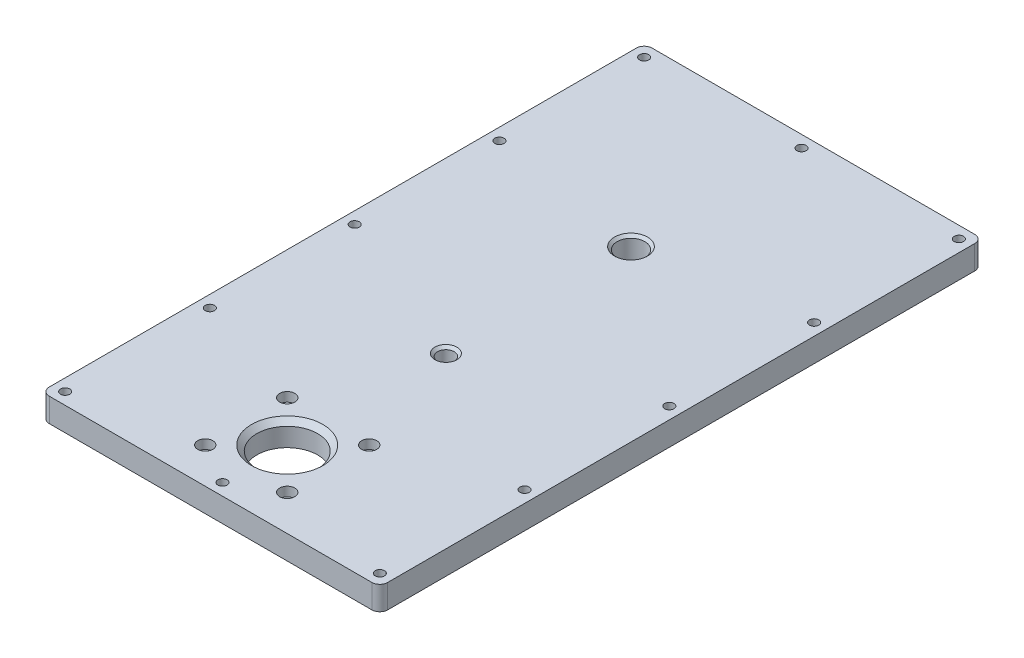
ISO-10303-21;
HEADER;
FILE_DESCRIPTION(('STEP AP214'),'2;1');
FILE_NAME('part.step','',(''),(''),'','','');
FILE_SCHEMA(('AUTOMOTIVE_DESIGN { 1 0 10303 214 1 1 1 1 }'));
ENDSEC;
DATA;
#1=APPLICATION_CONTEXT('core data for automotive mechanical design processes');
#2=APPLICATION_PROTOCOL_DEFINITION('international standard','automotive_design',2000,#1);
#3=PRODUCT_CONTEXT('',#1,'mechanical');
#4=PRODUCT('Part','Part','',(#3));
#5=PRODUCT_RELATED_PRODUCT_CATEGORY('part','',(#4));
#6=PRODUCT_DEFINITION_FORMATION('','',#4);
#7=PRODUCT_DEFINITION_CONTEXT('part definition',#1,'design');
#8=PRODUCT_DEFINITION('design','',#6,#7);
#9=PRODUCT_DEFINITION_SHAPE('','',#8);
#10=(LENGTH_UNIT() NAMED_UNIT(*) SI_UNIT(.MILLI.,.METRE.));
#11=(NAMED_UNIT(*) PLANE_ANGLE_UNIT() SI_UNIT($,.RADIAN.));
#12=(NAMED_UNIT(*) SI_UNIT($,.STERADIAN.) SOLID_ANGLE_UNIT());
#13=UNCERTAINTY_MEASURE_WITH_UNIT(LENGTH_MEASURE(1.E-05),#10,'distance_accuracy_value','');
#14=(GEOMETRIC_REPRESENTATION_CONTEXT(3) GLOBAL_UNCERTAINTY_ASSIGNED_CONTEXT((#13)) GLOBAL_UNIT_ASSIGNED_CONTEXT((#10,
#11,#12)) REPRESENTATION_CONTEXT('',''));
#15=CARTESIAN_POINT('',(0.,0.,0.));
#16=DIRECTION('',(0.,0.,1.));
#17=DIRECTION('',(1.,0.,0.));
#18=AXIS2_PLACEMENT_3D('',#15,#16,#17);
#19=CARTESIAN_POINT('',(0.,-30.5,0.));
#20=DIRECTION('',(0.,1.,0.));
#21=DIRECTION('',(0.,0.,1.));
#22=AXIS2_PLACEMENT_3D('',#19,#20,#21);
#23=CYLINDRICAL_SURFACE('',#22,3.15);
#24=CARTESIAN_POINT('',(0.,-22.5,0.));
#25=DIRECTION('',(0.,-1.,0.));
#26=DIRECTION('',(0.,0.,-1.));
#27=AXIS2_PLACEMENT_3D('',#24,#25,#26);
#28=CIRCLE('',#27,3.15);
#29=CARTESIAN_POINT('',(0.,-22.5,-3.15));
#30=VERTEX_POINT('',#29);
#31=EDGE_CURVE('E42',#30,#30,#28,.F.);
#32=ORIENTED_EDGE('',*,*,#31,.T.);
#33=EDGE_LOOP('',(#32));
#34=FACE_BOUND('',#33,.T.);
#35=CARTESIAN_POINT('',(0.,-27.5,0.));
#36=DIRECTION('',(0.,-1.,0.));
#37=DIRECTION('',(0.,0.,-1.));
#38=AXIS2_PLACEMENT_3D('',#35,#36,#37);
#39=CIRCLE('',#38,3.15);
#40=CARTESIAN_POINT('',(0.,-27.5,-3.15));
#41=VERTEX_POINT('',#40);
#42=EDGE_CURVE('E502',#41,#41,#39,.T.);
#43=ORIENTED_EDGE('',*,*,#42,.T.);
#44=EDGE_LOOP('',(#43));
#45=FACE_BOUND('',#44,.T.);
#46=ADVANCED_FACE('F34',(#34,#45),#23,.F.);
#47=CARTESIAN_POINT('',(-15.5,-30.5,75.5));
#48=DIRECTION('',(0.,1.,0.));
#49=DIRECTION('',(0.,0.,1.));
#50=AXIS2_PLACEMENT_3D('',#47,#48,#49);
#51=CYLINDRICAL_SURFACE('',#50,1.75);
#52=CARTESIAN_POINT('',(-15.5,-30.5,75.5));
#53=DIRECTION('',(0.,-1.,0.));
#54=DIRECTION('',(0.,0.,-1.));
#55=AXIS2_PLACEMENT_3D('',#52,#53,#54);
#56=CIRCLE('',#55,1.75);
#57=CARTESIAN_POINT('',(-15.5,-30.5,73.75));
#58=VERTEX_POINT('',#57);
#59=EDGE_CURVE('E136',#58,#58,#56,.T.);
#60=ORIENTED_EDGE('',*,*,#59,.T.);
#61=EDGE_LOOP('',(#60));
#62=FACE_BOUND('',#61,.T.);
#63=CARTESIAN_POINT('',(-15.5,-25.,75.5));
#64=DIRECTION('',(0.,1.,0.));
#65=DIRECTION('',(0.,0.,1.));
#66=AXIS2_PLACEMENT_3D('',#63,#64,#65);
#67=CIRCLE('',#66,1.75);
#68=CARTESIAN_POINT('',(-15.5,-25.,77.25));
#69=VERTEX_POINT('',#68);
#70=EDGE_CURVE('E155',#69,#69,#67,.T.);
#71=ORIENTED_EDGE('',*,*,#70,.T.);
#72=EDGE_LOOP('',(#71));
#73=FACE_BOUND('',#72,.T.);
#74=ADVANCED_FACE('F356',(#62,#73),#51,.F.);
#75=CARTESIAN_POINT('',(15.5,-30.5,75.5));
#76=DIRECTION('',(0.,1.,0.));
#77=DIRECTION('',(0.,0.,1.));
#78=AXIS2_PLACEMENT_3D('',#75,#76,#77);
#79=CYLINDRICAL_SURFACE('',#78,1.75);
#80=CARTESIAN_POINT('',(15.5,-30.5,75.5));
#81=DIRECTION('',(0.,-1.,0.));
#82=DIRECTION('',(0.,0.,-1.));
#83=AXIS2_PLACEMENT_3D('',#80,#81,#82);
#84=CIRCLE('',#83,1.75);
#85=CARTESIAN_POINT('',(15.5,-30.5,73.75));
#86=VERTEX_POINT('',#85);
#87=EDGE_CURVE('E316',#86,#86,#84,.T.);
#88=ORIENTED_EDGE('',*,*,#87,.T.);
#89=EDGE_LOOP('',(#88));
#90=FACE_BOUND('',#89,.T.);
#91=CARTESIAN_POINT('',(15.5,-25.,75.5));
#92=DIRECTION('',(0.,1.,0.));
#93=DIRECTION('',(0.,0.,1.));
#94=AXIS2_PLACEMENT_3D('',#91,#92,#93);
#95=CIRCLE('',#94,1.75);
#96=CARTESIAN_POINT('',(15.5,-25.,77.25));
#97=VERTEX_POINT('',#96);
#98=EDGE_CURVE('E152',#97,#97,#95,.T.);
#99=ORIENTED_EDGE('',*,*,#98,.T.);
#100=EDGE_LOOP('',(#99));
#101=FACE_BOUND('',#100,.T.);
#102=ADVANCED_FACE('F361',(#90,#101),#79,.F.);
#103=CARTESIAN_POINT('',(-15.5,-30.5,44.5));
#104=DIRECTION('',(0.,1.,0.));
#105=DIRECTION('',(0.,0.,1.));
#106=AXIS2_PLACEMENT_3D('',#103,#104,#105);
#107=CYLINDRICAL_SURFACE('',#106,1.75);
#108=CARTESIAN_POINT('',(-15.5,-30.5,44.5));
#109=DIRECTION('',(0.,-1.,0.));
#110=DIRECTION('',(0.,0.,-1.));
#111=AXIS2_PLACEMENT_3D('',#108,#109,#110);
#112=CIRCLE('',#111,1.75);
#113=CARTESIAN_POINT('',(-15.5,-30.5,42.75));
#114=VERTEX_POINT('',#113);
#115=EDGE_CURVE('E313',#114,#114,#112,.T.);
#116=ORIENTED_EDGE('',*,*,#115,.T.);
#117=EDGE_LOOP('',(#116));
#118=FACE_BOUND('',#117,.T.);
#119=CARTESIAN_POINT('',(-15.5,-25.,44.5));
#120=DIRECTION('',(0.,1.,0.));
#121=DIRECTION('',(0.,0.,1.));
#122=AXIS2_PLACEMENT_3D('',#119,#120,#121);
#123=CIRCLE('',#122,1.75);
#124=CARTESIAN_POINT('',(-15.5,-25.,46.25));
#125=VERTEX_POINT('',#124);
#126=EDGE_CURVE('E148',#125,#125,#123,.T.);
#127=ORIENTED_EDGE('',*,*,#126,.T.);
#128=EDGE_LOOP('',(#127));
#129=FACE_BOUND('',#128,.T.);
#130=ADVANCED_FACE('F420',(#118,#129),#107,.F.);
#131=CARTESIAN_POINT('',(15.5,-30.5,44.5));
#132=DIRECTION('',(0.,1.,0.));
#133=DIRECTION('',(0.,0.,1.));
#134=AXIS2_PLACEMENT_3D('',#131,#132,#133);
#135=CYLINDRICAL_SURFACE('',#134,1.75);
#136=CARTESIAN_POINT('',(15.5,-30.5,44.5));
#137=DIRECTION('',(0.,-1.,0.));
#138=DIRECTION('',(0.,0.,-1.));
#139=AXIS2_PLACEMENT_3D('',#136,#137,#138);
#140=CIRCLE('',#139,1.75);
#141=CARTESIAN_POINT('',(15.5,-30.5,42.75));
#142=VERTEX_POINT('',#141);
#143=EDGE_CURVE('E308',#142,#142,#140,.T.);
#144=ORIENTED_EDGE('',*,*,#143,.T.);
#145=EDGE_LOOP('',(#144));
#146=FACE_BOUND('',#145,.T.);
#147=CARTESIAN_POINT('',(15.5,-25.,44.5));
#148=DIRECTION('',(0.,1.,0.));
#149=DIRECTION('',(0.,0.,1.));
#150=AXIS2_PLACEMENT_3D('',#147,#148,#149);
#151=CIRCLE('',#150,1.75);
#152=CARTESIAN_POINT('',(15.5,-25.,46.25));
#153=VERTEX_POINT('',#152);
#154=EDGE_CURVE('E145',#153,#153,#151,.T.);
#155=ORIENTED_EDGE('',*,*,#154,.T.);
#156=EDGE_LOOP('',(#155));
#157=FACE_BOUND('',#156,.T.);
#158=ADVANCED_FACE('F417',(#146,#157),#135,.F.);
#159=CARTESIAN_POINT('',(0.,-30.5,0.));
#160=DIRECTION('',(0.,-1.,0.));
#161=DIRECTION('',(0.,0.,-1.));
#162=AXIS2_PLACEMENT_3D('',#159,#160,#161);
#163=PLANE('',#162);
#164=CARTESIAN_POINT('',(0.,-30.5,84.5));
#165=DIRECTION('',(0.,-1.,0.));
#166=DIRECTION('',(0.,0.,-1.));
#167=AXIS2_PLACEMENT_3D('',#164,#165,#166);
#168=CIRCLE('',#167,1.75);
#169=CARTESIAN_POINT('',(0.,-30.5,82.75));
#170=VERTEX_POINT('',#169);
#171=EDGE_CURVE('E245',#170,#170,#168,.T.);
#172=ORIENTED_EDGE('',*,*,#171,.F.);
#173=EDGE_LOOP('',(#172));
#174=FACE_BOUND('',#173,.T.);
#175=CARTESIAN_POINT('',(59.5,-30.5,29.75));
#176=DIRECTION('',(0.,-1.,0.));
#177=DIRECTION('',(0.,0.,-1.));
#178=AXIS2_PLACEMENT_3D('',#175,#176,#177);
#179=CIRCLE('',#178,1.75);
#180=CARTESIAN_POINT('',(59.5,-30.5,28.));
#181=VERTEX_POINT('',#180);
#182=EDGE_CURVE('E257',#181,#181,#179,.T.);
#183=ORIENTED_EDGE('',*,*,#182,.F.);
#184=EDGE_LOOP('',(#183));
#185=FACE_BOUND('',#184,.T.);
#186=CARTESIAN_POINT('',(-59.5,-30.5,29.75));
#187=DIRECTION('',(0.,-1.,0.));
#188=DIRECTION('',(0.,0.,-1.));
#189=AXIS2_PLACEMENT_3D('',#186,#187,#188);
#190=CIRCLE('',#189,1.75);
#191=CARTESIAN_POINT('',(-59.5,-30.5,28.));
#192=VERTEX_POINT('',#191);
#193=EDGE_CURVE('E269',#192,#192,#190,.T.);
#194=ORIENTED_EDGE('',*,*,#193,.F.);
#195=EDGE_LOOP('',(#194));
#196=FACE_BOUND('',#195,.T.);
#197=CARTESIAN_POINT('',(-59.5,-30.5,-79.75));
#198=DIRECTION('',(0.,-1.,0.));
#199=DIRECTION('',(0.,0.,-1.));
#200=AXIS2_PLACEMENT_3D('',#197,#198,#199);
#201=CIRCLE('',#200,1.75);
#202=CARTESIAN_POINT('',(-59.5,-30.5,-81.5));
#203=VERTEX_POINT('',#202);
#204=EDGE_CURVE('E281',#203,#203,#201,.T.);
#205=ORIENTED_EDGE('',*,*,#204,.F.);
#206=EDGE_LOOP('',(#205));
#207=FACE_BOUND('',#206,.T.);
#208=CARTESIAN_POINT('',(59.5,-30.5,-134.5));
#209=DIRECTION('',(0.,-1.,0.));
#210=DIRECTION('',(0.,0.,-1.));
#211=AXIS2_PLACEMENT_3D('',#208,#209,#210);
#212=CIRCLE('',#211,1.75);
#213=CARTESIAN_POINT('',(59.5,-30.5,-136.25));
#214=VERTEX_POINT('',#213);
#215=EDGE_CURVE('E293',#214,#214,#212,.T.);
#216=ORIENTED_EDGE('',*,*,#215,.F.);
#217=EDGE_LOOP('',(#216));
#218=FACE_BOUND('',#217,.T.);
#219=CARTESIAN_POINT('',(-59.5,-30.5,-134.5));
#220=DIRECTION('',(0.,-1.,0.));
#221=DIRECTION('',(0.,0.,-1.));
#222=AXIS2_PLACEMENT_3D('',#219,#220,#221);
#223=CIRCLE('',#222,1.75);
#224=CARTESIAN_POINT('',(-59.5,-30.5,-136.25));
#225=VERTEX_POINT('',#224);
#226=EDGE_CURVE('E305',#225,#225,#223,.T.);
#227=ORIENTED_EDGE('',*,*,#226,.F.);
#228=EDGE_LOOP('',(#227));
#229=FACE_BOUND('',#228,.T.);
#230=ORIENTED_EDGE('',*,*,#115,.F.);
#231=EDGE_LOOP('',(#230));
#232=FACE_BOUND('',#231,.T.);
#233=ORIENTED_EDGE('',*,*,#59,.F.);
#234=EDGE_LOOP('',(#233));
#235=FACE_BOUND('',#234,.T.);
#236=DIRECTION('',(-1.,0.,0.));
#237=VECTOR('',#236,1.);
#238=CARTESIAN_POINT('',(-64.,-30.5,89.));
#239=LINE('',#238,#237);
#240=CARTESIAN_POINT('',(61.,-30.5,89.));
#241=VERTEX_POINT('',#240);
#242=CARTESIAN_POINT('',(-61.,-30.5,89.));
#243=VERTEX_POINT('',#242);
#244=EDGE_CURVE('E139',#241,#243,#239,.T.);
#245=ORIENTED_EDGE('',*,*,#244,.T.);
#246=CARTESIAN_POINT('',(-61.,-30.5,86.));
#247=DIRECTION('',(0.,-1.,0.));
#248=DIRECTION('',(0.,0.,-1.));
#249=AXIS2_PLACEMENT_3D('',#246,#247,#248);
#250=CIRCLE('',#249,3.);
#251=CARTESIAN_POINT('',(-64.,-30.5,86.));
#252=VERTEX_POINT('',#251);
#253=EDGE_CURVE('E171',#243,#252,#250,.T.);
#254=ORIENTED_EDGE('',*,*,#253,.T.);
#255=DIRECTION('',(0.,0.,-1.));
#256=VECTOR('',#255,1.);
#257=CARTESIAN_POINT('',(-64.,-30.5,89.));
#258=LINE('',#257,#256);
#259=CARTESIAN_POINT('',(-64.,-30.5,-136.));
#260=VERTEX_POINT('',#259);
#261=EDGE_CURVE('E121',#252,#260,#258,.T.);
#262=ORIENTED_EDGE('',*,*,#261,.T.);
#263=CARTESIAN_POINT('',(-61.,-30.5,-136.));
#264=DIRECTION('',(0.,-1.,0.));
#265=DIRECTION('',(0.,0.,-1.));
#266=AXIS2_PLACEMENT_3D('',#263,#264,#265);
#267=CIRCLE('',#266,3.);
#268=CARTESIAN_POINT('',(-61.,-30.5,-139.));
#269=VERTEX_POINT('',#268);
#270=EDGE_CURVE('E167',#260,#269,#267,.T.);
#271=ORIENTED_EDGE('',*,*,#270,.T.);
#272=DIRECTION('',(1.,0.,0.));
#273=VECTOR('',#272,1.);
#274=CARTESIAN_POINT('',(-64.,-30.5,-139.));
#275=LINE('',#274,#273);
#276=CARTESIAN_POINT('',(61.,-30.5,-139.));
#277=VERTEX_POINT('',#276);
#278=EDGE_CURVE('E322',#269,#277,#275,.T.);
#279=ORIENTED_EDGE('',*,*,#278,.T.);
#280=CARTESIAN_POINT('',(61.,-30.5,-136.));
#281=DIRECTION('',(0.,-1.,0.));
#282=DIRECTION('',(0.,0.,-1.));
#283=AXIS2_PLACEMENT_3D('',#280,#281,#282);
#284=CIRCLE('',#283,3.);
#285=CARTESIAN_POINT('',(64.,-30.5,-136.));
#286=VERTEX_POINT('',#285);
#287=EDGE_CURVE('E56',#277,#286,#284,.T.);
#288=ORIENTED_EDGE('',*,*,#287,.T.);
#289=DIRECTION('',(0.,0.,1.));
#290=VECTOR('',#289,1.);
#291=CARTESIAN_POINT('',(64.,-30.5,89.));
#292=LINE('',#291,#290);
#293=CARTESIAN_POINT('',(64.,-30.5,86.));
#294=VERTEX_POINT('',#293);
#295=EDGE_CURVE('E323',#286,#294,#292,.T.);
#296=ORIENTED_EDGE('',*,*,#295,.T.);
#297=CARTESIAN_POINT('',(61.,-30.5,86.));
#298=DIRECTION('',(0.,-1.,0.));
#299=DIRECTION('',(0.,0.,-1.));
#300=AXIS2_PLACEMENT_3D('',#297,#298,#299);
#301=CIRCLE('',#300,3.);
#302=EDGE_CURVE('E169',#294,#241,#301,.T.);
#303=ORIENTED_EDGE('',*,*,#302,.T.);
#304=EDGE_LOOP('',(#245,#254,#262,#271,#279,#288,#296,#303));
#305=FACE_BOUND('',#304,.T.);
#306=CARTESIAN_POINT('',(0.,-30.5,60.));
#307=DIRECTION('',(0.,-1.,0.));
#308=DIRECTION('',(0.,0.,-1.));
#309=AXIS2_PLACEMENT_3D('',#306,#307,#308);
#310=CIRCLE('',#309,11.5);
#311=CARTESIAN_POINT('',(0.,-30.5,48.5));
#312=VERTEX_POINT('',#311);
#313=EDGE_CURVE('E130',#312,#312,#310,.T.);
#314=ORIENTED_EDGE('',*,*,#313,.F.);
#315=EDGE_LOOP('',(#314));
#316=FACE_BOUND('',#315,.T.);
#317=ORIENTED_EDGE('',*,*,#87,.F.);
#318=EDGE_LOOP('',(#317));
#319=FACE_BOUND('',#318,.T.);
#320=ORIENTED_EDGE('',*,*,#143,.F.);
#321=EDGE_LOOP('',(#320));
#322=FACE_BOUND('',#321,.T.);
#323=CARTESIAN_POINT('',(0.,-30.5,-134.5));
#324=DIRECTION('',(0.,-1.,0.));
#325=DIRECTION('',(0.,0.,-1.));
#326=AXIS2_PLACEMENT_3D('',#323,#324,#325);
#327=CIRCLE('',#326,1.75);
#328=CARTESIAN_POINT('',(0.,-30.5,-136.25));
#329=VERTEX_POINT('',#328);
#330=EDGE_CURVE('E299',#329,#329,#327,.T.);
#331=ORIENTED_EDGE('',*,*,#330,.F.);
#332=EDGE_LOOP('',(#331));
#333=FACE_BOUND('',#332,.T.);
#334=CARTESIAN_POINT('',(59.5,-30.5,-79.75));
#335=DIRECTION('',(0.,-1.,0.));
#336=DIRECTION('',(0.,0.,-1.));
#337=AXIS2_PLACEMENT_3D('',#334,#335,#336);
#338=CIRCLE('',#337,1.75);
#339=CARTESIAN_POINT('',(59.5,-30.5,-81.5));
#340=VERTEX_POINT('',#339);
#341=EDGE_CURVE('E287',#340,#340,#338,.T.);
#342=ORIENTED_EDGE('',*,*,#341,.F.);
#343=EDGE_LOOP('',(#342));
#344=FACE_BOUND('',#343,.T.);
#345=CARTESIAN_POINT('',(-59.5,-30.5,-25.));
#346=DIRECTION('',(0.,-1.,0.));
#347=DIRECTION('',(0.,0.,-1.));
#348=AXIS2_PLACEMENT_3D('',#345,#346,#347);
#349=CIRCLE('',#348,1.75);
#350=CARTESIAN_POINT('',(-59.5,-30.5,-26.75));
#351=VERTEX_POINT('',#350);
#352=EDGE_CURVE('E275',#351,#351,#349,.T.);
#353=ORIENTED_EDGE('',*,*,#352,.F.);
#354=EDGE_LOOP('',(#353));
#355=FACE_BOUND('',#354,.T.);
#356=CARTESIAN_POINT('',(59.5,-30.5,-25.));
#357=DIRECTION('',(0.,-1.,0.));
#358=DIRECTION('',(0.,0.,-1.));
#359=AXIS2_PLACEMENT_3D('',#356,#357,#358);
#360=CIRCLE('',#359,1.75);
#361=CARTESIAN_POINT('',(59.5,-30.5,-26.75));
#362=VERTEX_POINT('',#361);
#363=EDGE_CURVE('E263',#362,#362,#360,.T.);
#364=ORIENTED_EDGE('',*,*,#363,.F.);
#365=EDGE_LOOP('',(#364));
#366=FACE_BOUND('',#365,.T.);
#367=CARTESIAN_POINT('',(59.5,-30.5,84.5));
#368=DIRECTION('',(0.,-1.,0.));
#369=DIRECTION('',(0.,0.,-1.));
#370=AXIS2_PLACEMENT_3D('',#367,#368,#369);
#371=CIRCLE('',#370,1.75);
#372=CARTESIAN_POINT('',(59.5,-30.5,82.75));
#373=VERTEX_POINT('',#372);
#374=EDGE_CURVE('E251',#373,#373,#371,.T.);
#375=ORIENTED_EDGE('',*,*,#374,.F.);
#376=EDGE_LOOP('',(#375));
#377=FACE_BOUND('',#376,.T.);
#378=CARTESIAN_POINT('',(-59.5,-30.5,84.5));
#379=DIRECTION('',(0.,-1.,0.));
#380=DIRECTION('',(0.,0.,-1.));
#381=AXIS2_PLACEMENT_3D('',#378,#379,#380);
#382=CIRCLE('',#381,1.75);
#383=CARTESIAN_POINT('',(-59.5,-30.5,82.75));
#384=VERTEX_POINT('',#383);
#385=EDGE_CURVE('E239',#384,#384,#382,.T.);
#386=ORIENTED_EDGE('',*,*,#385,.F.);
#387=EDGE_LOOP('',(#386));
#388=FACE_BOUND('',#387,.T.);
#389=CARTESIAN_POINT('',(0.,-30.5,-70.));
#390=DIRECTION('',(0.,-1.,0.));
#391=DIRECTION('',(0.,0.,-1.));
#392=AXIS2_PLACEMENT_3D('',#389,#390,#391);
#393=CIRCLE('',#392,5.25);
#394=CARTESIAN_POINT('',(0.,-30.5,-75.25));
#395=VERTEX_POINT('',#394);
#396=EDGE_CURVE('E158',#395,#395,#393,.T.);
#397=ORIENTED_EDGE('',*,*,#396,.F.);
#398=EDGE_LOOP('',(#397));
#399=FACE_BOUND('',#398,.T.);
#400=ADVANCED_FACE('F206',(#174,#185,#196,#207,#218,#229,#232,#235,#305,#316,#319,#322,#333,
#344,#355,#366,#377,#388,#399),#163,.T.);
#401=CARTESIAN_POINT('',(0.,-21.5,0.));
#402=DIRECTION('',(0.,-1.,0.));
#403=DIRECTION('',(0.,0.,-1.));
#404=AXIS2_PLACEMENT_3D('',#401,#402,#403);
#405=PLANE('',#404);
#406=CARTESIAN_POINT('',(0.,-21.5,0.));
#407=DIRECTION('',(0.,-1.,0.));
#408=DIRECTION('',(0.,0.,-1.));
#409=AXIS2_PLACEMENT_3D('',#406,#407,#408);
#410=CIRCLE('',#409,4.15000000000001);
#411=CARTESIAN_POINT('',(0.,-21.5,-4.15000000000001));
#412=VERTEX_POINT('',#411);
#413=EDGE_CURVE('E191',#412,#412,#410,.T.);
#414=ORIENTED_EDGE('',*,*,#413,.T.);
#415=EDGE_LOOP('',(#414));
#416=FACE_BOUND('',#415,.T.);
#417=CARTESIAN_POINT('',(0.,-21.5,-70.));
#418=DIRECTION('',(0.,-1.,0.));
#419=DIRECTION('',(0.,0.,-1.));
#420=AXIS2_PLACEMENT_3D('',#417,#418,#419);
#421=CIRCLE('',#420,6.25000000000001);
#422=CARTESIAN_POINT('',(0.,-21.5,-76.25));
#423=VERTEX_POINT('',#422);
#424=EDGE_CURVE('E188',#423,#423,#421,.T.);
#425=ORIENTED_EDGE('',*,*,#424,.T.);
#426=EDGE_LOOP('',(#425));
#427=FACE_BOUND('',#426,.T.);
#428=CARTESIAN_POINT('',(0.,-21.5,60.));
#429=DIRECTION('',(0.,-1.,0.));
#430=DIRECTION('',(0.,0.,-1.));
#431=AXIS2_PLACEMENT_3D('',#428,#429,#430);
#432=CIRCLE('',#431,13.5);
#433=CARTESIAN_POINT('',(0.,-21.5,46.5));
#434=VERTEX_POINT('',#433);
#435=EDGE_CURVE('E182',#434,#434,#432,.T.);
#436=ORIENTED_EDGE('',*,*,#435,.T.);
#437=EDGE_LOOP('',(#436));
#438=FACE_BOUND('',#437,.T.);
#439=CARTESIAN_POINT('',(-15.5,-21.5,75.5));
#440=DIRECTION('',(0.,1.,0.));
#441=DIRECTION('',(0.,0.,1.));
#442=AXIS2_PLACEMENT_3D('',#439,#440,#441);
#443=CIRCLE('',#442,2.86);
#444=CARTESIAN_POINT('',(-15.5,-21.5,78.36));
#445=VERTEX_POINT('',#444);
#446=EDGE_CURVE('E215',#445,#445,#443,.T.);
#447=ORIENTED_EDGE('',*,*,#446,.F.);
#448=EDGE_LOOP('',(#447));
#449=FACE_BOUND('',#448,.T.);
#450=CARTESIAN_POINT('',(15.5,-21.5,75.5));
#451=DIRECTION('',(0.,1.,0.));
#452=DIRECTION('',(0.,0.,1.));
#453=AXIS2_PLACEMENT_3D('',#450,#451,#452);
#454=CIRCLE('',#453,2.86);
#455=CARTESIAN_POINT('',(15.5,-21.5,78.36));
#456=VERTEX_POINT('',#455);
#457=EDGE_CURVE('E219',#456,#456,#454,.T.);
#458=ORIENTED_EDGE('',*,*,#457,.F.);
#459=EDGE_LOOP('',(#458));
#460=FACE_BOUND('',#459,.T.);
#461=CARTESIAN_POINT('',(15.5,-21.5,44.5));
#462=DIRECTION('',(0.,1.,0.));
#463=DIRECTION('',(0.,0.,1.));
#464=AXIS2_PLACEMENT_3D('',#461,#462,#463);
#465=CIRCLE('',#464,2.86);
#466=CARTESIAN_POINT('',(15.5,-21.5,47.36));
#467=VERTEX_POINT('',#466);
#468=EDGE_CURVE('E223',#467,#467,#465,.T.);
#469=ORIENTED_EDGE('',*,*,#468,.F.);
#470=EDGE_LOOP('',(#469));
#471=FACE_BOUND('',#470,.T.);
#472=CARTESIAN_POINT('',(-15.5,-21.5,44.5));
#473=DIRECTION('',(0.,1.,0.));
#474=DIRECTION('',(0.,0.,1.));
#475=AXIS2_PLACEMENT_3D('',#472,#473,#474);
#476=CIRCLE('',#475,2.86);
#477=CARTESIAN_POINT('',(-15.5,-21.5,47.36));
#478=VERTEX_POINT('',#477);
#479=EDGE_CURVE('E226',#478,#478,#476,.T.);
#480=ORIENTED_EDGE('',*,*,#479,.F.);
#481=EDGE_LOOP('',(#480));
#482=FACE_BOUND('',#481,.T.);
#483=DIRECTION('',(0.,0.,-1.));
#484=VECTOR('',#483,1.);
#485=CARTESIAN_POINT('',(-64.,-21.5,89.));
#486=LINE('',#485,#484);
#487=CARTESIAN_POINT('',(-64.,-21.5,86.));
#488=VERTEX_POINT('',#487);
#489=CARTESIAN_POINT('',(-64.,-21.5,-136.));
#490=VERTEX_POINT('',#489);
#491=EDGE_CURVE('E118',#488,#490,#486,.T.);
#492=ORIENTED_EDGE('',*,*,#491,.F.);
#493=CARTESIAN_POINT('',(-61.,-21.5,86.));
#494=DIRECTION('',(0.,-1.,0.));
#495=DIRECTION('',(0.,0.,-1.));
#496=AXIS2_PLACEMENT_3D('',#493,#494,#495);
#497=CIRCLE('',#496,3.);
#498=CARTESIAN_POINT('',(-61.,-21.5,89.));
#499=VERTEX_POINT('',#498);
#500=EDGE_CURVE('E101',#488,#499,#497,.F.);
#501=ORIENTED_EDGE('',*,*,#500,.T.);
#502=DIRECTION('',(-1.,0.,0.));
#503=VECTOR('',#502,1.);
#504=CARTESIAN_POINT('',(-64.,-21.5,89.));
#505=LINE('',#504,#503);
#506=CARTESIAN_POINT('',(61.,-21.5,89.));
#507=VERTEX_POINT('',#506);
#508=EDGE_CURVE('E143',#507,#499,#505,.T.);
#509=ORIENTED_EDGE('',*,*,#508,.F.);
#510=CARTESIAN_POINT('',(61.,-21.5,86.));
#511=DIRECTION('',(0.,-1.,0.));
#512=DIRECTION('',(0.,0.,-1.));
#513=AXIS2_PLACEMENT_3D('',#510,#511,#512);
#514=CIRCLE('',#513,3.);
#515=CARTESIAN_POINT('',(64.,-21.5,86.));
#516=VERTEX_POINT('',#515);
#517=EDGE_CURVE('E112',#507,#516,#514,.F.);
#518=ORIENTED_EDGE('',*,*,#517,.T.);
#519=DIRECTION('',(0.,0.,1.));
#520=VECTOR('',#519,1.);
#521=CARTESIAN_POINT('',(64.,-21.5,89.));
#522=LINE('',#521,#520);
#523=CARTESIAN_POINT('',(64.,-21.5,-136.));
#524=VERTEX_POINT('',#523);
#525=EDGE_CURVE('E133',#524,#516,#522,.T.);
#526=ORIENTED_EDGE('',*,*,#525,.F.);
#527=CARTESIAN_POINT('',(61.,-21.5,-136.));
#528=DIRECTION('',(0.,-1.,0.));
#529=DIRECTION('',(0.,0.,-1.));
#530=AXIS2_PLACEMENT_3D('',#527,#528,#529);
#531=CIRCLE('',#530,3.);
#532=CARTESIAN_POINT('',(61.,-21.5,-139.));
#533=VERTEX_POINT('',#532);
#534=EDGE_CURVE('E122',#524,#533,#531,.F.);
#535=ORIENTED_EDGE('',*,*,#534,.T.);
#536=DIRECTION('',(1.,0.,0.));
#537=VECTOR('',#536,1.);
#538=CARTESIAN_POINT('',(-64.,-21.5,-139.));
#539=LINE('',#538,#537);
#540=CARTESIAN_POINT('',(-61.,-21.5,-139.));
#541=VERTEX_POINT('',#540);
#542=EDGE_CURVE('E129',#541,#533,#539,.T.);
#543=ORIENTED_EDGE('',*,*,#542,.F.);
#544=CARTESIAN_POINT('',(-61.,-21.5,-136.));
#545=DIRECTION('',(0.,-1.,0.));
#546=DIRECTION('',(0.,0.,-1.));
#547=AXIS2_PLACEMENT_3D('',#544,#545,#546);
#548=CIRCLE('',#547,3.);
#549=EDGE_CURVE('E128',#541,#490,#548,.F.);
#550=ORIENTED_EDGE('',*,*,#549,.T.);
#551=EDGE_LOOP('',(#492,#501,#509,#518,#526,#535,#543,#550));
#552=FACE_BOUND('',#551,.T.);
#553=CARTESIAN_POINT('',(-59.5,-21.5,-134.5));
#554=DIRECTION('',(0.,-1.,0.));
#555=DIRECTION('',(0.,0.,-1.));
#556=AXIS2_PLACEMENT_3D('',#553,#554,#555);
#557=CIRCLE('',#556,1.75);
#558=CARTESIAN_POINT('',(-59.5,-21.5,-136.25));
#559=VERTEX_POINT('',#558);
#560=EDGE_CURVE('E302',#559,#559,#557,.T.);
#561=ORIENTED_EDGE('',*,*,#560,.T.);
#562=EDGE_LOOP('',(#561));
#563=FACE_BOUND('',#562,.T.);
#564=CARTESIAN_POINT('',(0.,-21.5,-134.5));
#565=DIRECTION('',(0.,-1.,0.));
#566=DIRECTION('',(0.,0.,-1.));
#567=AXIS2_PLACEMENT_3D('',#564,#565,#566);
#568=CIRCLE('',#567,1.75);
#569=CARTESIAN_POINT('',(0.,-21.5,-136.25));
#570=VERTEX_POINT('',#569);
#571=EDGE_CURVE('E296',#570,#570,#568,.T.);
#572=ORIENTED_EDGE('',*,*,#571,.T.);
#573=EDGE_LOOP('',(#572));
#574=FACE_BOUND('',#573,.T.);
#575=CARTESIAN_POINT('',(59.5,-21.5,-134.5));
#576=DIRECTION('',(0.,-1.,0.));
#577=DIRECTION('',(0.,0.,-1.));
#578=AXIS2_PLACEMENT_3D('',#575,#576,#577);
#579=CIRCLE('',#578,1.75);
#580=CARTESIAN_POINT('',(59.5,-21.5,-136.25));
#581=VERTEX_POINT('',#580);
#582=EDGE_CURVE('E290',#581,#581,#579,.T.);
#583=ORIENTED_EDGE('',*,*,#582,.T.);
#584=EDGE_LOOP('',(#583));
#585=FACE_BOUND('',#584,.T.);
#586=CARTESIAN_POINT('',(59.5,-21.5,-79.75));
#587=DIRECTION('',(0.,-1.,0.));
#588=DIRECTION('',(0.,0.,-1.));
#589=AXIS2_PLACEMENT_3D('',#586,#587,#588);
#590=CIRCLE('',#589,1.75);
#591=CARTESIAN_POINT('',(59.5,-21.5,-81.5));
#592=VERTEX_POINT('',#591);
#593=EDGE_CURVE('E284',#592,#592,#590,.T.);
#594=ORIENTED_EDGE('',*,*,#593,.T.);
#595=EDGE_LOOP('',(#594));
#596=FACE_BOUND('',#595,.T.);
#597=CARTESIAN_POINT('',(-59.5,-21.5,-79.75));
#598=DIRECTION('',(0.,-1.,0.));
#599=DIRECTION('',(0.,0.,-1.));
#600=AXIS2_PLACEMENT_3D('',#597,#598,#599);
#601=CIRCLE('',#600,1.75);
#602=CARTESIAN_POINT('',(-59.5,-21.5,-81.5));
#603=VERTEX_POINT('',#602);
#604=EDGE_CURVE('E278',#603,#603,#601,.T.);
#605=ORIENTED_EDGE('',*,*,#604,.T.);
#606=EDGE_LOOP('',(#605));
#607=FACE_BOUND('',#606,.T.);
#608=CARTESIAN_POINT('',(-59.5,-21.5,-25.));
#609=DIRECTION('',(0.,-1.,0.));
#610=DIRECTION('',(0.,0.,-1.));
#611=AXIS2_PLACEMENT_3D('',#608,#609,#610);
#612=CIRCLE('',#611,1.75);
#613=CARTESIAN_POINT('',(-59.5,-21.5,-26.75));
#614=VERTEX_POINT('',#613);
#615=EDGE_CURVE('E272',#614,#614,#612,.T.);
#616=ORIENTED_EDGE('',*,*,#615,.T.);
#617=EDGE_LOOP('',(#616));
#618=FACE_BOUND('',#617,.T.);
#619=CARTESIAN_POINT('',(-59.5,-21.5,29.75));
#620=DIRECTION('',(0.,-1.,0.));
#621=DIRECTION('',(0.,0.,-1.));
#622=AXIS2_PLACEMENT_3D('',#619,#620,#621);
#623=CIRCLE('',#622,1.75);
#624=CARTESIAN_POINT('',(-59.5,-21.5,28.));
#625=VERTEX_POINT('',#624);
#626=EDGE_CURVE('E266',#625,#625,#623,.T.);
#627=ORIENTED_EDGE('',*,*,#626,.T.);
#628=EDGE_LOOP('',(#627));
#629=FACE_BOUND('',#628,.T.);
#630=CARTESIAN_POINT('',(59.5,-21.5,-25.));
#631=DIRECTION('',(0.,-1.,0.));
#632=DIRECTION('',(0.,0.,-1.));
#633=AXIS2_PLACEMENT_3D('',#630,#631,#632);
#634=CIRCLE('',#633,1.75);
#635=CARTESIAN_POINT('',(59.5,-21.5,-26.75));
#636=VERTEX_POINT('',#635);
#637=EDGE_CURVE('E260',#636,#636,#634,.T.);
#638=ORIENTED_EDGE('',*,*,#637,.T.);
#639=EDGE_LOOP('',(#638));
#640=FACE_BOUND('',#639,.T.);
#641=CARTESIAN_POINT('',(59.5,-21.5,29.75));
#642=DIRECTION('',(0.,-1.,0.));
#643=DIRECTION('',(0.,0.,-1.));
#644=AXIS2_PLACEMENT_3D('',#641,#642,#643);
#645=CIRCLE('',#644,1.75);
#646=CARTESIAN_POINT('',(59.5,-21.5,28.));
#647=VERTEX_POINT('',#646);
#648=EDGE_CURVE('E254',#647,#647,#645,.T.);
#649=ORIENTED_EDGE('',*,*,#648,.T.);
#650=EDGE_LOOP('',(#649));
#651=FACE_BOUND('',#650,.T.);
#652=CARTESIAN_POINT('',(59.5,-21.5,84.5));
#653=DIRECTION('',(0.,-1.,0.));
#654=DIRECTION('',(0.,0.,-1.));
#655=AXIS2_PLACEMENT_3D('',#652,#653,#654);
#656=CIRCLE('',#655,1.75);
#657=CARTESIAN_POINT('',(59.5,-21.5,82.75));
#658=VERTEX_POINT('',#657);
#659=EDGE_CURVE('E248',#658,#658,#656,.T.);
#660=ORIENTED_EDGE('',*,*,#659,.T.);
#661=EDGE_LOOP('',(#660));
#662=FACE_BOUND('',#661,.T.);
#663=CARTESIAN_POINT('',(0.,-21.5,84.5));
#664=DIRECTION('',(0.,-1.,0.));
#665=DIRECTION('',(0.,0.,-1.));
#666=AXIS2_PLACEMENT_3D('',#663,#664,#665);
#667=CIRCLE('',#666,1.75);
#668=CARTESIAN_POINT('',(0.,-21.5,82.75));
#669=VERTEX_POINT('',#668);
#670=EDGE_CURVE('E242',#669,#669,#667,.T.);
#671=ORIENTED_EDGE('',*,*,#670,.T.);
#672=EDGE_LOOP('',(#671));
#673=FACE_BOUND('',#672,.T.);
#674=CARTESIAN_POINT('',(-59.5,-21.5,84.5));
#675=DIRECTION('',(0.,-1.,0.));
#676=DIRECTION('',(0.,0.,-1.));
#677=AXIS2_PLACEMENT_3D('',#674,#675,#676);
#678=CIRCLE('',#677,1.75);
#679=CARTESIAN_POINT('',(-59.5,-21.5,82.75));
#680=VERTEX_POINT('',#679);
#681=EDGE_CURVE('E238',#680,#680,#678,.T.);
#682=ORIENTED_EDGE('',*,*,#681,.T.);
#683=EDGE_LOOP('',(#682));
#684=FACE_BOUND('',#683,.T.);
#685=ADVANCED_FACE('F125',(#416,#427,#438,#449,#460,#471,#482,#552,#563,#574,#585,#596,#607,
#618,#629,#640,#651,#662,#673,#684),#405,.F.);
#686=CARTESIAN_POINT('',(-64.,-30.5,89.));
#687=DIRECTION('',(1.,0.,0.));
#688=DIRECTION('',(0.,0.,-1.));
#689=AXIS2_PLACEMENT_3D('',#686,#687,#688);
#690=PLANE('',#689);
#691=ORIENTED_EDGE('',*,*,#261,.F.);
#692=DIRECTION('',(0.,1.,0.));
#693=VECTOR('',#692,1.);
#694=CARTESIAN_POINT('',(-64.,-30.5,86.));
#695=LINE('',#694,#693);
#696=EDGE_CURVE('E105',#252,#488,#695,.T.);
#697=ORIENTED_EDGE('',*,*,#696,.T.);
#698=ORIENTED_EDGE('',*,*,#491,.T.);
#699=DIRECTION('',(0.,1.,0.));
#700=VECTOR('',#699,1.);
#701=CARTESIAN_POINT('',(-64.,-30.5,-136.));
#702=LINE('',#701,#700);
#703=EDGE_CURVE('E123',#490,#260,#702,.F.);
#704=ORIENTED_EDGE('',*,*,#703,.T.);
#705=EDGE_LOOP('',(#691,#697,#698,#704));
#706=FACE_BOUND('',#705,.T.);
#707=ADVANCED_FACE('F117',(#706),#690,.F.);
#708=CARTESIAN_POINT('',(-64.,-30.5,-139.));
#709=DIRECTION('',(0.,0.,1.));
#710=DIRECTION('',(1.,0.,0.));
#711=AXIS2_PLACEMENT_3D('',#708,#709,#710);
#712=PLANE('',#711);
#713=ORIENTED_EDGE('',*,*,#278,.F.);
#714=DIRECTION('',(0.,1.,0.));
#715=VECTOR('',#714,1.);
#716=CARTESIAN_POINT('',(-61.,-30.5,-139.));
#717=LINE('',#716,#715);
#718=EDGE_CURVE('E179',#269,#541,#717,.T.);
#719=ORIENTED_EDGE('',*,*,#718,.T.);
#720=ORIENTED_EDGE('',*,*,#542,.T.);
#721=DIRECTION('',(0.,1.,0.));
#722=VECTOR('',#721,1.);
#723=CARTESIAN_POINT('',(61.,-30.5,-139.));
#724=LINE('',#723,#722);
#725=EDGE_CURVE('E177',#533,#277,#724,.F.);
#726=ORIENTED_EDGE('',*,*,#725,.T.);
#727=EDGE_LOOP('',(#713,#719,#720,#726));
#728=FACE_BOUND('',#727,.T.);
#729=ADVANCED_FACE('F341',(#728),#712,.F.);
#730=CARTESIAN_POINT('',(64.,-30.5,89.));
#731=DIRECTION('',(-1.,0.,0.));
#732=DIRECTION('',(0.,0.,1.));
#733=AXIS2_PLACEMENT_3D('',#730,#731,#732);
#734=PLANE('',#733);
#735=ORIENTED_EDGE('',*,*,#525,.T.);
#736=DIRECTION('',(0.,1.,0.));
#737=VECTOR('',#736,1.);
#738=CARTESIAN_POINT('',(64.,-30.5,86.));
#739=LINE('',#738,#737);
#740=EDGE_CURVE('E49',#516,#294,#739,.F.);
#741=ORIENTED_EDGE('',*,*,#740,.T.);
#742=ORIENTED_EDGE('',*,*,#295,.F.);
#743=DIRECTION('',(0.,1.,0.));
#744=VECTOR('',#743,1.);
#745=CARTESIAN_POINT('',(64.,-30.5,-136.));
#746=LINE('',#745,#744);
#747=EDGE_CURVE('E173',#286,#524,#746,.T.);
#748=ORIENTED_EDGE('',*,*,#747,.T.);
#749=EDGE_LOOP('',(#735,#741,#742,#748));
#750=FACE_BOUND('',#749,.T.);
#751=ADVANCED_FACE('F334',(#750),#734,.F.);
#752=CARTESIAN_POINT('',(-64.,-30.5,89.));
#753=DIRECTION('',(0.,0.,-1.));
#754=DIRECTION('',(-1.,0.,0.));
#755=AXIS2_PLACEMENT_3D('',#752,#753,#754);
#756=PLANE('',#755);
#757=ORIENTED_EDGE('',*,*,#508,.T.);
#758=DIRECTION('',(0.,1.,0.));
#759=VECTOR('',#758,1.);
#760=CARTESIAN_POINT('',(-61.,-30.5,89.));
#761=LINE('',#760,#759);
#762=EDGE_CURVE('E106',#499,#243,#761,.F.);
#763=ORIENTED_EDGE('',*,*,#762,.T.);
#764=ORIENTED_EDGE('',*,*,#244,.F.);
#765=DIRECTION('',(0.,1.,0.));
#766=VECTOR('',#765,1.);
#767=CARTESIAN_POINT('',(61.,-30.5,89.));
#768=LINE('',#767,#766);
#769=EDGE_CURVE('E111',#241,#507,#768,.T.);
#770=ORIENTED_EDGE('',*,*,#769,.T.);
#771=EDGE_LOOP('',(#757,#763,#764,#770));
#772=FACE_BOUND('',#771,.T.);
#773=ADVANCED_FACE('F330',(#772),#756,.F.);
#774=CARTESIAN_POINT('',(0.,-30.5,60.));
#775=DIRECTION('',(0.,1.,0.));
#776=DIRECTION('',(0.,0.,1.));
#777=AXIS2_PLACEMENT_3D('',#774,#775,#776);
#778=CYLINDRICAL_SURFACE('',#777,11.5);
#779=CARTESIAN_POINT('',(0.,-23.5,60.));
#780=DIRECTION('',(0.,-1.,0.));
#781=DIRECTION('',(0.,0.,-1.));
#782=AXIS2_PLACEMENT_3D('',#779,#780,#781);
#783=CIRCLE('',#782,11.5);
#784=CARTESIAN_POINT('',(0.,-23.5,48.5));
#785=VERTEX_POINT('',#784);
#786=EDGE_CURVE('E185',#785,#785,#783,.F.);
#787=ORIENTED_EDGE('',*,*,#786,.T.);
#788=EDGE_LOOP('',(#787));
#789=FACE_BOUND('',#788,.T.);
#790=ORIENTED_EDGE('',*,*,#313,.T.);
#791=EDGE_LOOP('',(#790));
#792=FACE_BOUND('',#791,.T.);
#793=ADVANCED_FACE('F415',(#789,#792),#778,.F.);
#794=CARTESIAN_POINT('',(-59.5,-30.5,-134.5));
#795=DIRECTION('',(0.,1.,0.));
#796=DIRECTION('',(0.,0.,1.));
#797=AXIS2_PLACEMENT_3D('',#794,#795,#796);
#798=CYLINDRICAL_SURFACE('',#797,1.75);
#799=ORIENTED_EDGE('',*,*,#226,.T.);
#800=EDGE_LOOP('',(#799));
#801=FACE_BOUND('',#800,.T.);
#802=ORIENTED_EDGE('',*,*,#560,.F.);
#803=EDGE_LOOP('',(#802));
#804=FACE_BOUND('',#803,.T.);
#805=ADVANCED_FACE('F411',(#801,#804),#798,.F.);
#806=CARTESIAN_POINT('',(0.,-30.5,-134.5));
#807=DIRECTION('',(0.,1.,0.));
#808=DIRECTION('',(0.,0.,1.));
#809=AXIS2_PLACEMENT_3D('',#806,#807,#808);
#810=CYLINDRICAL_SURFACE('',#809,1.75);
#811=ORIENTED_EDGE('',*,*,#330,.T.);
#812=EDGE_LOOP('',(#811));
#813=FACE_BOUND('',#812,.T.);
#814=ORIENTED_EDGE('',*,*,#571,.F.);
#815=EDGE_LOOP('',(#814));
#816=FACE_BOUND('',#815,.T.);
#817=ADVANCED_FACE('F407',(#813,#816),#810,.F.);
#818=CARTESIAN_POINT('',(59.5,-30.5,-134.5));
#819=DIRECTION('',(0.,1.,0.));
#820=DIRECTION('',(0.,0.,1.));
#821=AXIS2_PLACEMENT_3D('',#818,#819,#820);
#822=CYLINDRICAL_SURFACE('',#821,1.75);
#823=ORIENTED_EDGE('',*,*,#215,.T.);
#824=EDGE_LOOP('',(#823));
#825=FACE_BOUND('',#824,.T.);
#826=ORIENTED_EDGE('',*,*,#582,.F.);
#827=EDGE_LOOP('',(#826));
#828=FACE_BOUND('',#827,.T.);
#829=ADVANCED_FACE('F403',(#825,#828),#822,.F.);
#830=CARTESIAN_POINT('',(59.5,-30.5,-79.75));
#831=DIRECTION('',(0.,1.,0.));
#832=DIRECTION('',(0.,0.,1.));
#833=AXIS2_PLACEMENT_3D('',#830,#831,#832);
#834=CYLINDRICAL_SURFACE('',#833,1.75);
#835=ORIENTED_EDGE('',*,*,#341,.T.);
#836=EDGE_LOOP('',(#835));
#837=FACE_BOUND('',#836,.T.);
#838=ORIENTED_EDGE('',*,*,#593,.F.);
#839=EDGE_LOOP('',(#838));
#840=FACE_BOUND('',#839,.T.);
#841=ADVANCED_FACE('F399',(#837,#840),#834,.F.);
#842=CARTESIAN_POINT('',(-59.5,-30.5,-79.75));
#843=DIRECTION('',(0.,1.,0.));
#844=DIRECTION('',(0.,0.,1.));
#845=AXIS2_PLACEMENT_3D('',#842,#843,#844);
#846=CYLINDRICAL_SURFACE('',#845,1.75);
#847=ORIENTED_EDGE('',*,*,#204,.T.);
#848=EDGE_LOOP('',(#847));
#849=FACE_BOUND('',#848,.T.);
#850=ORIENTED_EDGE('',*,*,#604,.F.);
#851=EDGE_LOOP('',(#850));
#852=FACE_BOUND('',#851,.T.);
#853=ADVANCED_FACE('F395',(#849,#852),#846,.F.);
#854=CARTESIAN_POINT('',(-59.5,-30.5,-25.));
#855=DIRECTION('',(0.,1.,0.));
#856=DIRECTION('',(0.,0.,1.));
#857=AXIS2_PLACEMENT_3D('',#854,#855,#856);
#858=CYLINDRICAL_SURFACE('',#857,1.75);
#859=ORIENTED_EDGE('',*,*,#352,.T.);
#860=EDGE_LOOP('',(#859));
#861=FACE_BOUND('',#860,.T.);
#862=ORIENTED_EDGE('',*,*,#615,.F.);
#863=EDGE_LOOP('',(#862));
#864=FACE_BOUND('',#863,.T.);
#865=ADVANCED_FACE('F391',(#861,#864),#858,.F.);
#866=CARTESIAN_POINT('',(-59.5,-30.5,29.75));
#867=DIRECTION('',(0.,1.,0.));
#868=DIRECTION('',(0.,0.,1.));
#869=AXIS2_PLACEMENT_3D('',#866,#867,#868);
#870=CYLINDRICAL_SURFACE('',#869,1.75);
#871=ORIENTED_EDGE('',*,*,#193,.T.);
#872=EDGE_LOOP('',(#871));
#873=FACE_BOUND('',#872,.T.);
#874=ORIENTED_EDGE('',*,*,#626,.F.);
#875=EDGE_LOOP('',(#874));
#876=FACE_BOUND('',#875,.T.);
#877=ADVANCED_FACE('F387',(#873,#876),#870,.F.);
#878=CARTESIAN_POINT('',(59.5,-30.5,-25.));
#879=DIRECTION('',(0.,1.,0.));
#880=DIRECTION('',(0.,0.,1.));
#881=AXIS2_PLACEMENT_3D('',#878,#879,#880);
#882=CYLINDRICAL_SURFACE('',#881,1.75);
#883=ORIENTED_EDGE('',*,*,#363,.T.);
#884=EDGE_LOOP('',(#883));
#885=FACE_BOUND('',#884,.T.);
#886=ORIENTED_EDGE('',*,*,#637,.F.);
#887=EDGE_LOOP('',(#886));
#888=FACE_BOUND('',#887,.T.);
#889=ADVANCED_FACE('F383',(#885,#888),#882,.F.);
#890=CARTESIAN_POINT('',(59.5,-30.5,29.75));
#891=DIRECTION('',(0.,1.,0.));
#892=DIRECTION('',(0.,0.,1.));
#893=AXIS2_PLACEMENT_3D('',#890,#891,#892);
#894=CYLINDRICAL_SURFACE('',#893,1.75);
#895=ORIENTED_EDGE('',*,*,#182,.T.);
#896=EDGE_LOOP('',(#895));
#897=FACE_BOUND('',#896,.T.);
#898=ORIENTED_EDGE('',*,*,#648,.F.);
#899=EDGE_LOOP('',(#898));
#900=FACE_BOUND('',#899,.T.);
#901=ADVANCED_FACE('F379',(#897,#900),#894,.F.);
#902=CARTESIAN_POINT('',(59.5,-30.5,84.5));
#903=DIRECTION('',(0.,1.,0.));
#904=DIRECTION('',(0.,0.,1.));
#905=AXIS2_PLACEMENT_3D('',#902,#903,#904);
#906=CYLINDRICAL_SURFACE('',#905,1.75);
#907=ORIENTED_EDGE('',*,*,#374,.T.);
#908=EDGE_LOOP('',(#907));
#909=FACE_BOUND('',#908,.T.);
#910=ORIENTED_EDGE('',*,*,#659,.F.);
#911=EDGE_LOOP('',(#910));
#912=FACE_BOUND('',#911,.T.);
#913=ADVANCED_FACE('F375',(#909,#912),#906,.F.);
#914=CARTESIAN_POINT('',(0.,-30.5,84.5));
#915=DIRECTION('',(0.,1.,0.));
#916=DIRECTION('',(0.,0.,1.));
#917=AXIS2_PLACEMENT_3D('',#914,#915,#916);
#918=CYLINDRICAL_SURFACE('',#917,1.75);
#919=ORIENTED_EDGE('',*,*,#171,.T.);
#920=EDGE_LOOP('',(#919));
#921=FACE_BOUND('',#920,.T.);
#922=ORIENTED_EDGE('',*,*,#670,.F.);
#923=EDGE_LOOP('',(#922));
#924=FACE_BOUND('',#923,.T.);
#925=ADVANCED_FACE('F371',(#921,#924),#918,.F.);
#926=CARTESIAN_POINT('',(-59.5,-30.5,84.5));
#927=DIRECTION('',(0.,1.,0.));
#928=DIRECTION('',(0.,0.,1.));
#929=AXIS2_PLACEMENT_3D('',#926,#927,#928);
#930=CYLINDRICAL_SURFACE('',#929,1.75);
#931=ORIENTED_EDGE('',*,*,#385,.T.);
#932=EDGE_LOOP('',(#931));
#933=FACE_BOUND('',#932,.T.);
#934=ORIENTED_EDGE('',*,*,#681,.F.);
#935=EDGE_LOOP('',(#934));
#936=FACE_BOUND('',#935,.T.);
#937=ADVANCED_FACE('F368',(#933,#936),#930,.F.);
#938=CARTESIAN_POINT('',(0.,-30.5,-70.));
#939=DIRECTION('',(0.,1.,0.));
#940=DIRECTION('',(0.,0.,1.));
#941=AXIS2_PLACEMENT_3D('',#938,#939,#940);
#942=CYLINDRICAL_SURFACE('',#941,5.25);
#943=CARTESIAN_POINT('',(0.,-22.5,-70.));
#944=DIRECTION('',(0.,-1.,0.));
#945=DIRECTION('',(0.,0.,-1.));
#946=AXIS2_PLACEMENT_3D('',#943,#944,#945);
#947=CIRCLE('',#946,5.25);
#948=CARTESIAN_POINT('',(0.,-22.5,-75.25));
#949=VERTEX_POINT('',#948);
#950=EDGE_CURVE('E11',#949,#949,#947,.F.);
#951=ORIENTED_EDGE('',*,*,#950,.T.);
#952=EDGE_LOOP('',(#951));
#953=FACE_BOUND('',#952,.T.);
#954=ORIENTED_EDGE('',*,*,#396,.T.);
#955=EDGE_LOOP('',(#954));
#956=FACE_BOUND('',#955,.T.);
#957=ADVANCED_FACE('F366',(#953,#956),#942,.F.);
#958=CARTESIAN_POINT('',(15.5,-25.,44.5));
#959=DIRECTION('',(0.,1.,0.));
#960=DIRECTION('',(0.,0.,1.));
#961=AXIS2_PLACEMENT_3D('',#958,#959,#960);
#962=CYLINDRICAL_SURFACE('',#961,2.86);
#963=CARTESIAN_POINT('',(15.5,-25.,44.5));
#964=DIRECTION('',(0.,1.,0.));
#965=DIRECTION('',(0.,0.,1.));
#966=AXIS2_PLACEMENT_3D('',#963,#964,#965);
#967=CIRCLE('',#966,2.86);
#968=CARTESIAN_POINT('',(15.5,-25.,47.36));
#969=VERTEX_POINT('',#968);
#970=EDGE_CURVE('E228',#969,#969,#967,.T.);
#971=ORIENTED_EDGE('',*,*,#970,.F.);
#972=EDGE_LOOP('',(#971));
#973=FACE_BOUND('',#972,.T.);
#974=ORIENTED_EDGE('',*,*,#468,.T.);
#975=EDGE_LOOP('',(#974));
#976=FACE_BOUND('',#975,.T.);
#977=ADVANCED_FACE('F472',(#973,#976),#962,.F.);
#978=CARTESIAN_POINT('',(15.5,-25.,44.5));
#979=DIRECTION('',(0.,1.,0.));
#980=DIRECTION('',(0.,0.,1.));
#981=AXIS2_PLACEMENT_3D('',#978,#979,#980);
#982=PLANE('',#981);
#983=ORIENTED_EDGE('',*,*,#154,.F.);
#984=EDGE_LOOP('',(#983));
#985=FACE_BOUND('',#984,.T.);
#986=ORIENTED_EDGE('',*,*,#970,.T.);
#987=EDGE_LOOP('',(#986));
#988=FACE_BOUND('',#987,.T.);
#989=ADVANCED_FACE('F467',(#985,#988),#982,.T.);
#990=CARTESIAN_POINT('',(-15.5,-25.,44.5));
#991=DIRECTION('',(0.,1.,0.));
#992=DIRECTION('',(0.,0.,1.));
#993=AXIS2_PLACEMENT_3D('',#990,#991,#992);
#994=CYLINDRICAL_SURFACE('',#993,2.86);
#995=CARTESIAN_POINT('',(-15.5,-25.,44.5));
#996=DIRECTION('',(0.,1.,0.));
#997=DIRECTION('',(0.,0.,1.));
#998=AXIS2_PLACEMENT_3D('',#995,#996,#997);
#999=CIRCLE('',#998,2.86);
#1000=CARTESIAN_POINT('',(-15.5,-25.,47.36));
#1001=VERTEX_POINT('',#1000);
#1002=EDGE_CURVE('E149',#1001,#1001,#999,.T.);
#1003=ORIENTED_EDGE('',*,*,#1002,.F.);
#1004=EDGE_LOOP('',(#1003));
#1005=FACE_BOUND('',#1004,.T.);
#1006=ORIENTED_EDGE('',*,*,#479,.T.);
#1007=EDGE_LOOP('',(#1006));
#1008=FACE_BOUND('',#1007,.T.);
#1009=ADVANCED_FACE('F464',(#1005,#1008),#994,.F.);
#1010=CARTESIAN_POINT('',(-15.5,-25.,44.5));
#1011=DIRECTION('',(0.,1.,0.));
#1012=DIRECTION('',(0.,0.,1.));
#1013=AXIS2_PLACEMENT_3D('',#1010,#1011,#1012);
#1014=PLANE('',#1013);
#1015=ORIENTED_EDGE('',*,*,#126,.F.);
#1016=EDGE_LOOP('',(#1015));
#1017=FACE_BOUND('',#1016,.T.);
#1018=ORIENTED_EDGE('',*,*,#1002,.T.);
#1019=EDGE_LOOP('',(#1018));
#1020=FACE_BOUND('',#1019,.T.);
#1021=ADVANCED_FACE('F462',(#1017,#1020),#1014,.T.);
#1022=CARTESIAN_POINT('',(15.5,-25.,75.5));
#1023=DIRECTION('',(0.,1.,0.));
#1024=DIRECTION('',(0.,0.,1.));
#1025=AXIS2_PLACEMENT_3D('',#1022,#1023,#1024);
#1026=CYLINDRICAL_SURFACE('',#1025,2.86);
#1027=CARTESIAN_POINT('',(15.5,-25.,75.5));
#1028=DIRECTION('',(0.,1.,0.));
#1029=DIRECTION('',(0.,0.,1.));
#1030=AXIS2_PLACEMENT_3D('',#1027,#1028,#1029);
#1031=CIRCLE('',#1030,2.86);
#1032=CARTESIAN_POINT('',(15.5,-25.,78.36));
#1033=VERTEX_POINT('',#1032);
#1034=EDGE_CURVE('E495',#1033,#1033,#1031,.T.);
#1035=ORIENTED_EDGE('',*,*,#1034,.F.);
#1036=EDGE_LOOP('',(#1035));
#1037=FACE_BOUND('',#1036,.T.);
#1038=ORIENTED_EDGE('',*,*,#457,.T.);
#1039=EDGE_LOOP('',(#1038));
#1040=FACE_BOUND('',#1039,.T.);
#1041=ADVANCED_FACE('F459',(#1037,#1040),#1026,.F.);
#1042=CARTESIAN_POINT('',(15.5,-25.,75.5));
#1043=DIRECTION('',(0.,1.,0.));
#1044=DIRECTION('',(0.,0.,1.));
#1045=AXIS2_PLACEMENT_3D('',#1042,#1043,#1044);
#1046=PLANE('',#1045);
#1047=ORIENTED_EDGE('',*,*,#98,.F.);
#1048=EDGE_LOOP('',(#1047));
#1049=FACE_BOUND('',#1048,.T.);
#1050=ORIENTED_EDGE('',*,*,#1034,.T.);
#1051=EDGE_LOOP('',(#1050));
#1052=FACE_BOUND('',#1051,.T.);
#1053=ADVANCED_FACE('F453',(#1049,#1052),#1046,.T.);
#1054=CARTESIAN_POINT('',(-15.5,-25.,75.5));
#1055=DIRECTION('',(0.,1.,0.));
#1056=DIRECTION('',(0.,0.,1.));
#1057=AXIS2_PLACEMENT_3D('',#1054,#1055,#1056);
#1058=CYLINDRICAL_SURFACE('',#1057,2.86);
#1059=CARTESIAN_POINT('',(-15.5,-25.,75.5));
#1060=DIRECTION('',(0.,1.,0.));
#1061=DIRECTION('',(0.,0.,1.));
#1062=AXIS2_PLACEMENT_3D('',#1059,#1060,#1061);
#1063=CIRCLE('',#1062,2.86);
#1064=CARTESIAN_POINT('',(-15.5,-25.,78.36));
#1065=VERTEX_POINT('',#1064);
#1066=EDGE_CURVE('E498',#1065,#1065,#1063,.T.);
#1067=ORIENTED_EDGE('',*,*,#1066,.F.);
#1068=EDGE_LOOP('',(#1067));
#1069=FACE_BOUND('',#1068,.T.);
#1070=ORIENTED_EDGE('',*,*,#446,.T.);
#1071=EDGE_LOOP('',(#1070));
#1072=FACE_BOUND('',#1071,.T.);
#1073=ADVANCED_FACE('F447',(#1069,#1072),#1058,.F.);
#1074=CARTESIAN_POINT('',(-15.5,-25.,75.5));
#1075=DIRECTION('',(0.,1.,0.));
#1076=DIRECTION('',(0.,0.,1.));
#1077=AXIS2_PLACEMENT_3D('',#1074,#1075,#1076);
#1078=PLANE('',#1077);
#1079=ORIENTED_EDGE('',*,*,#70,.F.);
#1080=EDGE_LOOP('',(#1079));
#1081=FACE_BOUND('',#1080,.T.);
#1082=ORIENTED_EDGE('',*,*,#1066,.T.);
#1083=EDGE_LOOP('',(#1082));
#1084=FACE_BOUND('',#1083,.T.);
#1085=ADVANCED_FACE('F443',(#1081,#1084),#1078,.T.);
#1086=CARTESIAN_POINT('',(-61.,-30.5,86.));
#1087=DIRECTION('',(0.,1.,0.));
#1088=DIRECTION('',(0.,0.,1.));
#1089=AXIS2_PLACEMENT_3D('',#1086,#1087,#1088);
#1090=CYLINDRICAL_SURFACE('',#1089,3.);
#1091=ORIENTED_EDGE('',*,*,#253,.F.);
#1092=ORIENTED_EDGE('',*,*,#762,.F.);
#1093=ORIENTED_EDGE('',*,*,#500,.F.);
#1094=ORIENTED_EDGE('',*,*,#696,.F.);
#1095=EDGE_LOOP('',(#1091,#1092,#1093,#1094));
#1096=FACE_BOUND('',#1095,.T.);
#1097=ADVANCED_FACE('F104',(#1096),#1090,.T.);
#1098=CARTESIAN_POINT('',(61.,-30.5,86.));
#1099=DIRECTION('',(0.,1.,0.));
#1100=DIRECTION('',(0.,0.,1.));
#1101=AXIS2_PLACEMENT_3D('',#1098,#1099,#1100);
#1102=CYLINDRICAL_SURFACE('',#1101,3.);
#1103=ORIENTED_EDGE('',*,*,#302,.F.);
#1104=ORIENTED_EDGE('',*,*,#740,.F.);
#1105=ORIENTED_EDGE('',*,*,#517,.F.);
#1106=ORIENTED_EDGE('',*,*,#769,.F.);
#1107=EDGE_LOOP('',(#1103,#1104,#1105,#1106));
#1108=FACE_BOUND('',#1107,.T.);
#1109=ADVANCED_FACE('F332',(#1108),#1102,.T.);
#1110=CARTESIAN_POINT('',(-61.,-30.5,-136.));
#1111=DIRECTION('',(0.,1.,0.));
#1112=DIRECTION('',(0.,0.,1.));
#1113=AXIS2_PLACEMENT_3D('',#1110,#1111,#1112);
#1114=CYLINDRICAL_SURFACE('',#1113,3.);
#1115=ORIENTED_EDGE('',*,*,#270,.F.);
#1116=ORIENTED_EDGE('',*,*,#703,.F.);
#1117=ORIENTED_EDGE('',*,*,#549,.F.);
#1118=ORIENTED_EDGE('',*,*,#718,.F.);
#1119=EDGE_LOOP('',(#1115,#1116,#1117,#1118));
#1120=FACE_BOUND('',#1119,.T.);
#1121=ADVANCED_FACE('F345',(#1120),#1114,.T.);
#1122=CARTESIAN_POINT('',(61.,-30.5,-136.));
#1123=DIRECTION('',(0.,1.,0.));
#1124=DIRECTION('',(0.,0.,1.));
#1125=AXIS2_PLACEMENT_3D('',#1122,#1123,#1124);
#1126=CYLINDRICAL_SURFACE('',#1125,3.);
#1127=ORIENTED_EDGE('',*,*,#287,.F.);
#1128=ORIENTED_EDGE('',*,*,#725,.F.);
#1129=ORIENTED_EDGE('',*,*,#534,.F.);
#1130=ORIENTED_EDGE('',*,*,#747,.F.);
#1131=EDGE_LOOP('',(#1127,#1128,#1129,#1130));
#1132=FACE_BOUND('',#1131,.T.);
#1133=ADVANCED_FACE('F337',(#1132),#1126,.T.);
#1134=CARTESIAN_POINT('',(0.,-27.5,0.));
#1135=DIRECTION('',(0.,-1.,0.));
#1136=DIRECTION('',(0.,0.,-1.));
#1137=AXIS2_PLACEMENT_3D('',#1134,#1135,#1136);
#1138=PLANE('',#1137);
#1139=ORIENTED_EDGE('',*,*,#42,.F.);
#1140=EDGE_LOOP('',(#1139));
#1141=FACE_BOUND('',#1140,.T.);
#1142=ADVANCED_FACE('F352',(#1141),#1138,.F.);
#1143=CARTESIAN_POINT('',(0.,-21.5,60.));
#1144=DIRECTION('',(0.,1.,0.));
#1145=DIRECTION('',(0.,0.,1.));
#1146=AXIS2_PLACEMENT_3D('',#1143,#1144,#1145);
#1147=CONICAL_SURFACE('',#1146,13.5,0.785398163397444);
#1148=ORIENTED_EDGE('',*,*,#786,.F.);
#1149=EDGE_LOOP('',(#1148));
#1150=FACE_BOUND('',#1149,.T.);
#1151=ORIENTED_EDGE('',*,*,#435,.F.);
#1152=EDGE_LOOP('',(#1151));
#1153=FACE_BOUND('',#1152,.T.);
#1154=ADVANCED_FACE('F201',(#1150,#1153),#1147,.F.);
#1155=CARTESIAN_POINT('',(0.,-21.5,0.));
#1156=DIRECTION('',(0.,1.,0.));
#1157=DIRECTION('',(0.,0.,1.));
#1158=AXIS2_PLACEMENT_3D('',#1155,#1156,#1157);
#1159=CONICAL_SURFACE('',#1158,4.15000000000001,0.785398163397453);
#1160=ORIENTED_EDGE('',*,*,#31,.F.);
#1161=EDGE_LOOP('',(#1160));
#1162=FACE_BOUND('',#1161,.T.);
#1163=ORIENTED_EDGE('',*,*,#413,.F.);
#1164=EDGE_LOOP('',(#1163));
#1165=FACE_BOUND('',#1164,.T.);
#1166=ADVANCED_FACE('F198',(#1162,#1165),#1159,.F.);
#1167=CARTESIAN_POINT('',(0.,-21.5,-70.));
#1168=DIRECTION('',(0.,1.,0.));
#1169=DIRECTION('',(0.,0.,1.));
#1170=AXIS2_PLACEMENT_3D('',#1167,#1168,#1169);
#1171=CONICAL_SURFACE('',#1170,6.25000000000001,0.785398163397454);
#1172=ORIENTED_EDGE('',*,*,#950,.F.);
#1173=EDGE_LOOP('',(#1172));
#1174=FACE_BOUND('',#1173,.T.);
#1175=ORIENTED_EDGE('',*,*,#424,.F.);
#1176=EDGE_LOOP('',(#1175));
#1177=FACE_BOUND('',#1176,.T.);
#1178=ADVANCED_FACE('F36',(#1174,#1177),#1171,.F.);
#1179=CLOSED_SHELL('',(#46,#74,#102,#130,#158,#400,#685,#707,#729,#751,#773,#793,#805,#817,#829,
#841,#853,#865,#877,#889,#901,#913,#925,#937,#957,#977,#989,#1009,#1021,#1041,#1053,#1073,#1085,
#1097,#1109,#1121,#1133,#1142,#1154,#1166,#1178));
#1180=MANIFOLD_SOLID_BREP('B2',#1179);
#1181=ADVANCED_BREP_SHAPE_REPRESENTATION('',(#18,#1180),#14);
#1182=SHAPE_DEFINITION_REPRESENTATION(#9,#1181);
ENDSEC;
END-ISO-10303-21;
